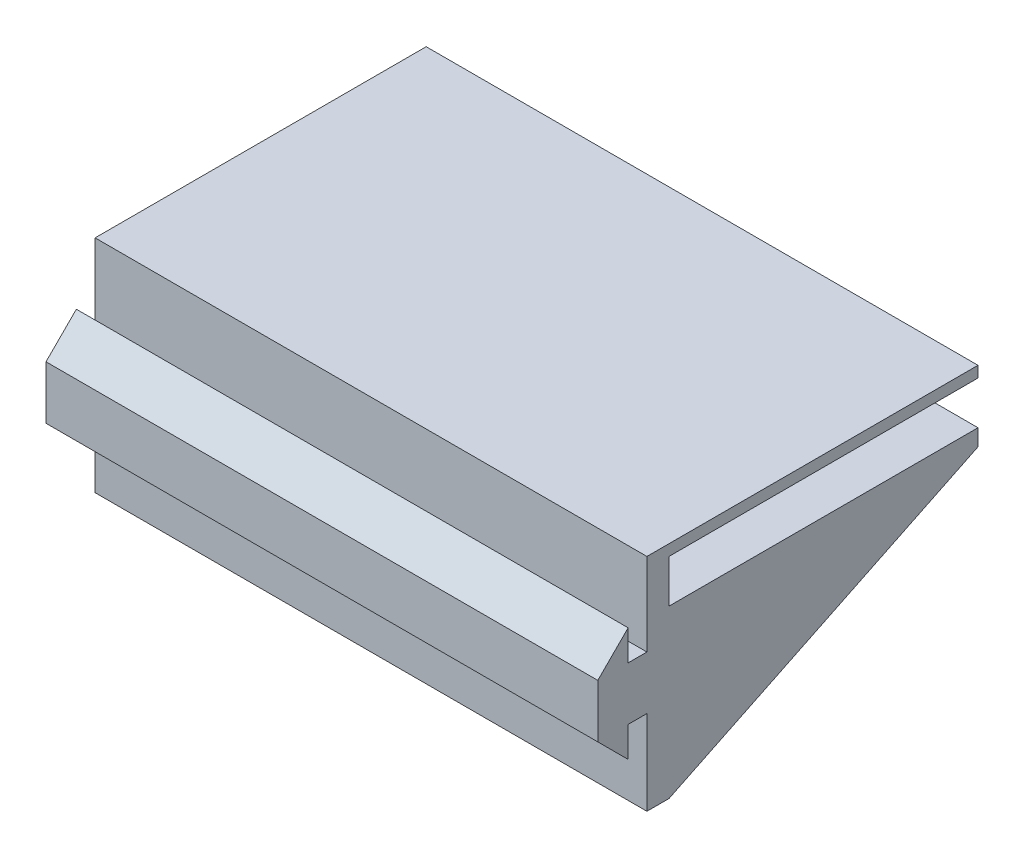
ISO-10303-21;
HEADER;
FILE_DESCRIPTION(('STEP AP214'),'2;1');
FILE_NAME('part.step','',(''),(''),'','','');
FILE_SCHEMA(('AUTOMOTIVE_DESIGN { 1 0 10303 214 1 1 1 1 }'));
ENDSEC;
DATA;
#1=APPLICATION_CONTEXT('core data for automotive mechanical design processes');
#2=APPLICATION_PROTOCOL_DEFINITION('international standard','automotive_design',2000,#1);
#3=PRODUCT_CONTEXT('',#1,'mechanical');
#4=PRODUCT('Part','Part','',(#3));
#5=PRODUCT_RELATED_PRODUCT_CATEGORY('part','',(#4));
#6=PRODUCT_DEFINITION_FORMATION('','',#4);
#7=PRODUCT_DEFINITION_CONTEXT('part definition',#1,'design');
#8=PRODUCT_DEFINITION('design','',#6,#7);
#9=PRODUCT_DEFINITION_SHAPE('','',#8);
#10=(LENGTH_UNIT() NAMED_UNIT(*) SI_UNIT(.MILLI.,.METRE.));
#11=(NAMED_UNIT(*) PLANE_ANGLE_UNIT() SI_UNIT($,.RADIAN.));
#12=(NAMED_UNIT(*) SI_UNIT($,.STERADIAN.) SOLID_ANGLE_UNIT());
#13=UNCERTAINTY_MEASURE_WITH_UNIT(LENGTH_MEASURE(1.E-05),#10,'distance_accuracy_value','');
#14=(GEOMETRIC_REPRESENTATION_CONTEXT(3) GLOBAL_UNCERTAINTY_ASSIGNED_CONTEXT((#13)) GLOBAL_UNIT_ASSIGNED_CONTEXT((#10,
#11,#12)) REPRESENTATION_CONTEXT('',''));
#15=CARTESIAN_POINT('',(0.,0.,0.));
#16=DIRECTION('',(0.,0.,1.));
#17=DIRECTION('',(1.,0.,0.));
#18=AXIS2_PLACEMENT_3D('',#15,#16,#17);
#19=CARTESIAN_POINT('',(50.,13.6,0.));
#20=DIRECTION('',(0.,-1.,0.));
#21=DIRECTION('',(0.,0.,-1.));
#22=AXIS2_PLACEMENT_3D('',#19,#20,#21);
#23=PLANE('',#22);
#24=DIRECTION('',(-1.,0.,0.));
#25=VECTOR('',#24,1.);
#26=CARTESIAN_POINT('',(50.,13.6,-30.));
#27=LINE('',#26,#25);
#28=CARTESIAN_POINT('',(48.5,13.6,-30.));
#29=VERTEX_POINT('',#28);
#30=CARTESIAN_POINT('',(1.5,13.6,-30.));
#31=VERTEX_POINT('',#30);
#32=EDGE_CURVE('E42',#29,#31,#27,.T.);
#33=ORIENTED_EDGE('',*,*,#32,.F.);
#34=DIRECTION('',(0.,0.,1.));
#35=VECTOR('',#34,1.);
#36=CARTESIAN_POINT('',(48.5,13.6,-30.));
#37=LINE('',#36,#35);
#38=CARTESIAN_POINT('',(48.5,13.6,-2.));
#39=VERTEX_POINT('',#38);
#40=EDGE_CURVE('E174',#29,#39,#37,.T.);
#41=ORIENTED_EDGE('',*,*,#40,.T.);
#42=DIRECTION('',(-1.,0.,0.));
#43=VECTOR('',#42,1.);
#44=CARTESIAN_POINT('',(50.,13.6,-2.));
#45=LINE('',#44,#43);
#46=CARTESIAN_POINT('',(1.5,13.6,-2.));
#47=VERTEX_POINT('',#46);
#48=EDGE_CURVE('E180',#39,#47,#45,.T.);
#49=ORIENTED_EDGE('',*,*,#48,.T.);
#50=DIRECTION('',(0.,0.,1.));
#51=VECTOR('',#50,1.);
#52=CARTESIAN_POINT('',(1.5,13.6,0.));
#53=LINE('',#52,#51);
#54=EDGE_CURVE('E349',#31,#47,#53,.T.);
#55=ORIENTED_EDGE('',*,*,#54,.F.);
#56=EDGE_LOOP('',(#33,#41,#49,#55));
#57=FACE_BOUND('',#56,.T.);
#58=ADVANCED_FACE('F35',(#57),#23,.T.);
#59=CARTESIAN_POINT('',(50.,0.,-2.));
#60=DIRECTION('',(0.,0.,1.));
#61=DIRECTION('',(0.,-1.,0.));
#62=AXIS2_PLACEMENT_3D('',#59,#60,#61);
#63=PLANE('',#62);
#64=DIRECTION('',(0.,-1.,0.));
#65=VECTOR('',#64,1.);
#66=CARTESIAN_POINT('',(48.5,13.6,-2.));
#67=LINE('',#66,#65);
#68=CARTESIAN_POINT('',(48.5,0.,-2.));
#69=VERTEX_POINT('',#68);
#70=EDGE_CURVE('E171',#39,#69,#67,.T.);
#71=ORIENTED_EDGE('',*,*,#70,.T.);
#72=DIRECTION('',(-1.,0.,0.));
#73=VECTOR('',#72,1.);
#74=CARTESIAN_POINT('',(50.,0.,-2.));
#75=LINE('',#74,#73);
#76=CARTESIAN_POINT('',(1.5,0.,-2.));
#77=VERTEX_POINT('',#76);
#78=EDGE_CURVE('E55',#69,#77,#75,.T.);
#79=ORIENTED_EDGE('',*,*,#78,.T.);
#80=DIRECTION('',(0.,1.,0.));
#81=VECTOR('',#80,1.);
#82=CARTESIAN_POINT('',(1.5,0.,-2.));
#83=LINE('',#82,#81);
#84=EDGE_CURVE('E185',#77,#47,#83,.T.);
#85=ORIENTED_EDGE('',*,*,#84,.T.);
#86=ORIENTED_EDGE('',*,*,#48,.F.);
#87=EDGE_LOOP('',(#71,#79,#85,#86));
#88=FACE_BOUND('',#87,.T.);
#89=ADVANCED_FACE('F183',(#88),#63,.F.);
#90=CARTESIAN_POINT('',(50.,0.,-30.));
#91=DIRECTION('',(0.,0.,-1.));
#92=DIRECTION('',(-1.,0.,0.));
#93=AXIS2_PLACEMENT_3D('',#90,#91,#92);
#94=PLANE('',#93);
#95=DIRECTION('',(0.,-1.,0.));
#96=VECTOR('',#95,1.);
#97=CARTESIAN_POINT('',(0.,0.,-30.));
#98=LINE('',#97,#96);
#99=CARTESIAN_POINT('',(0.,15.1,-30.));
#100=VERTEX_POINT('',#99);
#101=CARTESIAN_POINT('',(0.,13.6,-30.));
#102=VERTEX_POINT('',#101);
#103=EDGE_CURVE('E241',#100,#102,#98,.T.);
#104=ORIENTED_EDGE('',*,*,#103,.F.);
#105=DIRECTION('',(-1.,0.,0.));
#106=VECTOR('',#105,1.);
#107=CARTESIAN_POINT('',(50.,15.1,-30.));
#108=LINE('',#107,#106);
#109=CARTESIAN_POINT('',(50.,15.1,-30.));
#110=VERTEX_POINT('',#109);
#111=EDGE_CURVE('E227',#110,#100,#108,.T.);
#112=ORIENTED_EDGE('',*,*,#111,.F.);
#113=DIRECTION('',(0.,-1.,0.));
#114=VECTOR('',#113,1.);
#115=CARTESIAN_POINT('',(50.,0.,-30.));
#116=LINE('',#115,#114);
#117=CARTESIAN_POINT('',(50.,13.6,-30.));
#118=VERTEX_POINT('',#117);
#119=EDGE_CURVE('E291',#110,#118,#116,.T.);
#120=ORIENTED_EDGE('',*,*,#119,.T.);
#121=EDGE_CURVE('E11',#118,#29,#27,.T.);
#122=ORIENTED_EDGE('',*,*,#121,.T.);
#123=ORIENTED_EDGE('',*,*,#32,.T.);
#124=DIRECTION('',(-1.,0.,0.));
#125=VECTOR('',#124,1.);
#126=CARTESIAN_POINT('',(1.5,13.6,-30.));
#127=LINE('',#126,#125);
#128=EDGE_CURVE('E244',#31,#102,#127,.T.);
#129=ORIENTED_EDGE('',*,*,#128,.T.);
#130=EDGE_LOOP('',(#104,#112,#120,#122,#123,#129));
#131=FACE_BOUND('',#130,.T.);
#132=ADVANCED_FACE('F242',(#131),#94,.T.);
#133=CARTESIAN_POINT('',(50.,15.1,0.));
#134=DIRECTION('',(0.,1.,0.));
#135=DIRECTION('',(0.,0.,1.));
#136=AXIS2_PLACEMENT_3D('',#133,#134,#135);
#137=PLANE('',#136);
#138=DIRECTION('',(0.,0.,-1.));
#139=VECTOR('',#138,1.);
#140=CARTESIAN_POINT('',(0.,15.1,0.));
#141=LINE('',#140,#139);
#142=CARTESIAN_POINT('',(0.,15.1,-2.));
#143=VERTEX_POINT('',#142);
#144=EDGE_CURVE('E234',#143,#100,#141,.T.);
#145=ORIENTED_EDGE('',*,*,#144,.F.);
#146=DIRECTION('',(-1.,0.,0.));
#147=VECTOR('',#146,1.);
#148=CARTESIAN_POINT('',(50.,15.1,-2.));
#149=LINE('',#148,#147);
#150=CARTESIAN_POINT('',(50.,15.1,-2.));
#151=VERTEX_POINT('',#150);
#152=EDGE_CURVE('E226',#151,#143,#149,.T.);
#153=ORIENTED_EDGE('',*,*,#152,.F.);
#154=DIRECTION('',(0.,0.,-1.));
#155=VECTOR('',#154,1.);
#156=CARTESIAN_POINT('',(50.,15.1,0.));
#157=LINE('',#156,#155);
#158=EDGE_CURVE('E237',#151,#110,#157,.T.);
#159=ORIENTED_EDGE('',*,*,#158,.T.);
#160=ORIENTED_EDGE('',*,*,#111,.T.);
#161=EDGE_LOOP('',(#145,#153,#159,#160));
#162=FACE_BOUND('',#161,.T.);
#163=ADVANCED_FACE('F232',(#162),#137,.T.);
#164=CARTESIAN_POINT('',(50.,0.,-2.));
#165=DIRECTION('',(0.,0.,-1.));
#166=DIRECTION('',(0.,1.,0.));
#167=AXIS2_PLACEMENT_3D('',#164,#165,#166);
#168=PLANE('',#167);
#169=DIRECTION('',(0.,-1.,0.));
#170=VECTOR('',#169,1.);
#171=CARTESIAN_POINT('',(0.,0.,-2.));
#172=LINE('',#171,#170);
#173=CARTESIAN_POINT('',(0.,19.,-2.));
#174=VERTEX_POINT('',#173);
#175=EDGE_CURVE('E252',#174,#143,#172,.T.);
#176=ORIENTED_EDGE('',*,*,#175,.F.);
#177=DIRECTION('',(-1.,0.,0.));
#178=VECTOR('',#177,1.);
#179=CARTESIAN_POINT('',(50.,19.,-2.));
#180=LINE('',#179,#178);
#181=CARTESIAN_POINT('',(50.,19.,-2.));
#182=VERTEX_POINT('',#181);
#183=EDGE_CURVE('E224',#182,#174,#180,.T.);
#184=ORIENTED_EDGE('',*,*,#183,.F.);
#185=DIRECTION('',(0.,-1.,0.));
#186=VECTOR('',#185,1.);
#187=CARTESIAN_POINT('',(50.,0.,-2.));
#188=LINE('',#187,#186);
#189=EDGE_CURVE('E293',#182,#151,#188,.T.);
#190=ORIENTED_EDGE('',*,*,#189,.T.);
#191=ORIENTED_EDGE('',*,*,#152,.T.);
#192=EDGE_LOOP('',(#176,#184,#190,#191));
#193=FACE_BOUND('',#192,.T.);
#194=ADVANCED_FACE('F422',(#193),#168,.T.);
#195=CARTESIAN_POINT('',(50.,19.,0.));
#196=DIRECTION('',(0.,-1.,0.));
#197=DIRECTION('',(0.,0.,-1.));
#198=AXIS2_PLACEMENT_3D('',#195,#196,#197);
#199=PLANE('',#198);
#200=DIRECTION('',(0.,0.,1.));
#201=VECTOR('',#200,1.);
#202=CARTESIAN_POINT('',(0.,19.,0.));
#203=LINE('',#202,#201);
#204=CARTESIAN_POINT('',(0.,19.,-30.));
#205=VERTEX_POINT('',#204);
#206=EDGE_CURVE('E254',#205,#174,#203,.T.);
#207=ORIENTED_EDGE('',*,*,#206,.F.);
#208=DIRECTION('',(-1.,0.,0.));
#209=VECTOR('',#208,1.);
#210=CARTESIAN_POINT('',(50.,19.,-30.));
#211=LINE('',#210,#209);
#212=CARTESIAN_POINT('',(50.,19.,-30.));
#213=VERTEX_POINT('',#212);
#214=EDGE_CURVE('E222',#213,#205,#211,.T.);
#215=ORIENTED_EDGE('',*,*,#214,.F.);
#216=DIRECTION('',(0.,0.,1.));
#217=VECTOR('',#216,1.);
#218=CARTESIAN_POINT('',(50.,19.,0.));
#219=LINE('',#218,#217);
#220=EDGE_CURVE('E300',#213,#182,#219,.T.);
#221=ORIENTED_EDGE('',*,*,#220,.T.);
#222=ORIENTED_EDGE('',*,*,#183,.T.);
#223=EDGE_LOOP('',(#207,#215,#221,#222));
#224=FACE_BOUND('',#223,.T.);
#225=ADVANCED_FACE('F418',(#224),#199,.T.);
#226=CARTESIAN_POINT('',(50.,0.,-30.));
#227=DIRECTION('',(0.,0.,-1.));
#228=DIRECTION('',(-1.,0.,0.));
#229=AXIS2_PLACEMENT_3D('',#226,#227,#228);
#230=PLANE('',#229);
#231=DIRECTION('',(0.,-1.,0.));
#232=VECTOR('',#231,1.);
#233=CARTESIAN_POINT('',(0.,0.,-30.));
#234=LINE('',#233,#232);
#235=CARTESIAN_POINT('',(0.,20.,-30.));
#236=VERTEX_POINT('',#235);
#237=EDGE_CURVE('E258',#236,#205,#234,.T.);
#238=ORIENTED_EDGE('',*,*,#237,.F.);
#239=DIRECTION('',(-1.,0.,0.));
#240=VECTOR('',#239,1.);
#241=CARTESIAN_POINT('',(50.,20.,-30.));
#242=LINE('',#241,#240);
#243=CARTESIAN_POINT('',(50.,20.,-30.));
#244=VERTEX_POINT('',#243);
#245=EDGE_CURVE('E220',#244,#236,#242,.T.);
#246=ORIENTED_EDGE('',*,*,#245,.F.);
#247=DIRECTION('',(0.,-1.,0.));
#248=VECTOR('',#247,1.);
#249=CARTESIAN_POINT('',(50.,0.,-30.));
#250=LINE('',#249,#248);
#251=EDGE_CURVE('E303',#244,#213,#250,.T.);
#252=ORIENTED_EDGE('',*,*,#251,.T.);
#253=ORIENTED_EDGE('',*,*,#214,.T.);
#254=EDGE_LOOP('',(#238,#246,#252,#253));
#255=FACE_BOUND('',#254,.T.);
#256=ADVANCED_FACE('F414',(#255),#230,.T.);
#257=CARTESIAN_POINT('',(50.,20.,0.));
#258=DIRECTION('',(0.,1.,0.));
#259=DIRECTION('',(0.,0.,1.));
#260=AXIS2_PLACEMENT_3D('',#257,#258,#259);
#261=PLANE('',#260);
#262=DIRECTION('',(0.,0.,-1.));
#263=VECTOR('',#262,1.);
#264=CARTESIAN_POINT('',(0.,20.,0.));
#265=LINE('',#264,#263);
#266=CARTESIAN_POINT('',(0.,20.,0.));
#267=VERTEX_POINT('',#266);
#268=EDGE_CURVE('E261',#267,#236,#265,.T.);
#269=ORIENTED_EDGE('',*,*,#268,.F.);
#270=DIRECTION('',(-1.,0.,0.));
#271=VECTOR('',#270,1.);
#272=CARTESIAN_POINT('',(50.,20.,0.));
#273=LINE('',#272,#271);
#274=CARTESIAN_POINT('',(50.,20.,0.));
#275=VERTEX_POINT('',#274);
#276=EDGE_CURVE('E218',#275,#267,#273,.T.);
#277=ORIENTED_EDGE('',*,*,#276,.F.);
#278=DIRECTION('',(0.,0.,-1.));
#279=VECTOR('',#278,1.);
#280=CARTESIAN_POINT('',(50.,20.,0.));
#281=LINE('',#280,#279);
#282=EDGE_CURVE('E306',#275,#244,#281,.T.);
#283=ORIENTED_EDGE('',*,*,#282,.T.);
#284=ORIENTED_EDGE('',*,*,#245,.T.);
#285=EDGE_LOOP('',(#269,#277,#283,#284));
#286=FACE_BOUND('',#285,.T.);
#287=ADVANCED_FACE('F411',(#286),#261,.T.);
#288=CARTESIAN_POINT('',(50.,0.,0.));
#289=DIRECTION('',(0.,0.,1.));
#290=DIRECTION('',(1.,0.,0.));
#291=AXIS2_PLACEMENT_3D('',#288,#289,#290);
#292=PLANE('',#291);
#293=DIRECTION('',(0.,1.,0.));
#294=VECTOR('',#293,1.);
#295=CARTESIAN_POINT('',(0.,0.,0.));
#296=LINE('',#295,#294);
#297=CARTESIAN_POINT('',(0.,12.5,0.));
#298=VERTEX_POINT('',#297);
#299=EDGE_CURVE('E264',#298,#267,#296,.T.);
#300=ORIENTED_EDGE('',*,*,#299,.F.);
#301=DIRECTION('',(-1.,0.,0.));
#302=VECTOR('',#301,1.);
#303=CARTESIAN_POINT('',(50.,12.5,0.));
#304=LINE('',#303,#302);
#305=CARTESIAN_POINT('',(50.,12.5,0.));
#306=VERTEX_POINT('',#305);
#307=EDGE_CURVE('E216',#306,#298,#304,.T.);
#308=ORIENTED_EDGE('',*,*,#307,.F.);
#309=DIRECTION('',(0.,1.,0.));
#310=VECTOR('',#309,1.);
#311=CARTESIAN_POINT('',(50.,0.,0.));
#312=LINE('',#311,#310);
#313=EDGE_CURVE('E309',#306,#275,#312,.T.);
#314=ORIENTED_EDGE('',*,*,#313,.T.);
#315=ORIENTED_EDGE('',*,*,#276,.T.);
#316=EDGE_LOOP('',(#300,#308,#314,#315));
#317=FACE_BOUND('',#316,.T.);
#318=ADVANCED_FACE('F384',(#317),#292,.T.);
#319=CARTESIAN_POINT('',(50.,12.5,0.));
#320=DIRECTION('',(0.,1.,0.));
#321=DIRECTION('',(0.,0.,1.));
#322=AXIS2_PLACEMENT_3D('',#319,#320,#321);
#323=PLANE('',#322);
#324=DIRECTION('',(0.,0.,-1.));
#325=VECTOR('',#324,1.);
#326=CARTESIAN_POINT('',(0.,12.5,0.));
#327=LINE('',#326,#325);
#328=CARTESIAN_POINT('',(0.,12.5,1.7));
#329=VERTEX_POINT('',#328);
#330=EDGE_CURVE('E267',#329,#298,#327,.T.);
#331=ORIENTED_EDGE('',*,*,#330,.F.);
#332=DIRECTION('',(-1.,0.,0.));
#333=VECTOR('',#332,1.);
#334=CARTESIAN_POINT('',(50.,12.5,1.7));
#335=LINE('',#334,#333);
#336=CARTESIAN_POINT('',(50.,12.5,1.7));
#337=VERTEX_POINT('',#336);
#338=EDGE_CURVE('E214',#337,#329,#335,.T.);
#339=ORIENTED_EDGE('',*,*,#338,.F.);
#340=DIRECTION('',(0.,0.,-1.));
#341=VECTOR('',#340,1.);
#342=CARTESIAN_POINT('',(50.,12.5,0.));
#343=LINE('',#342,#341);
#344=EDGE_CURVE('E312',#337,#306,#343,.T.);
#345=ORIENTED_EDGE('',*,*,#344,.T.);
#346=ORIENTED_EDGE('',*,*,#307,.T.);
#347=EDGE_LOOP('',(#331,#339,#345,#346));
#348=FACE_BOUND('',#347,.T.);
#349=ADVANCED_FACE('F406',(#348),#323,.T.);
#350=CARTESIAN_POINT('',(50.,0.,1.7));
#351=DIRECTION('',(0.,0.,1.));
#352=DIRECTION('',(1.,0.,0.));
#353=AXIS2_PLACEMENT_3D('',#350,#351,#352);
#354=PLANE('',#353);
#355=DIRECTION('',(0.,1.,0.));
#356=VECTOR('',#355,1.);
#357=CARTESIAN_POINT('',(0.,0.,1.7));
#358=LINE('',#357,#356);
#359=CARTESIAN_POINT('',(0.,15.25,1.7));
#360=VERTEX_POINT('',#359);
#361=EDGE_CURVE('E271',#329,#360,#358,.T.);
#362=ORIENTED_EDGE('',*,*,#361,.T.);
#363=DIRECTION('',(-1.,0.,0.));
#364=VECTOR('',#363,1.);
#365=CARTESIAN_POINT('',(50.,15.25,1.7));
#366=LINE('',#365,#364);
#367=CARTESIAN_POINT('',(50.,15.25,1.7));
#368=VERTEX_POINT('',#367);
#369=EDGE_CURVE('E211',#368,#360,#366,.T.);
#370=ORIENTED_EDGE('',*,*,#369,.F.);
#371=DIRECTION('',(0.,1.,0.));
#372=VECTOR('',#371,1.);
#373=CARTESIAN_POINT('',(50.,0.,1.7));
#374=LINE('',#373,#372);
#375=EDGE_CURVE('E315',#337,#368,#374,.T.);
#376=ORIENTED_EDGE('',*,*,#375,.F.);
#377=ORIENTED_EDGE('',*,*,#338,.T.);
#378=EDGE_LOOP('',(#362,#370,#376,#377));
#379=FACE_BOUND('',#378,.T.);
#380=ADVANCED_FACE('F402',(#379),#354,.F.);
#381=CARTESIAN_POINT('',(50.,8.47499999999992,8.47500000000001));
#382=DIRECTION('',(0.,-0.707106781186544,-0.707106781186551));
#383=DIRECTION('',(0.,0.707106781186551,-0.707106781186544));
#384=AXIS2_PLACEMENT_3D('',#381,#382,#383);
#385=PLANE('',#384);
#386=DIRECTION('',(0.,-0.707106781186551,0.707106781186544));
#387=VECTOR('',#386,1.);
#388=CARTESIAN_POINT('',(0.,8.47499999999992,8.47500000000001));
#389=LINE('',#388,#387);
#390=CARTESIAN_POINT('',(0.,12.5,4.44999999999997));
#391=VERTEX_POINT('',#390);
#392=EDGE_CURVE('E273',#360,#391,#389,.T.);
#393=ORIENTED_EDGE('',*,*,#392,.T.);
#394=DIRECTION('',(-1.,0.,0.));
#395=VECTOR('',#394,1.);
#396=CARTESIAN_POINT('',(50.,12.5,4.44999999999997));
#397=LINE('',#396,#395);
#398=CARTESIAN_POINT('',(50.,12.5,4.44999999999997));
#399=VERTEX_POINT('',#398);
#400=EDGE_CURVE('E208',#399,#391,#397,.T.);
#401=ORIENTED_EDGE('',*,*,#400,.F.);
#402=DIRECTION('',(0.,-0.707106781186551,0.707106781186544));
#403=VECTOR('',#402,1.);
#404=CARTESIAN_POINT('',(50.,8.47499999999992,8.47500000000001));
#405=LINE('',#404,#403);
#406=EDGE_CURVE('E317',#368,#399,#405,.T.);
#407=ORIENTED_EDGE('',*,*,#406,.F.);
#408=ORIENTED_EDGE('',*,*,#369,.T.);
#409=EDGE_LOOP('',(#393,#401,#407,#408));
#410=FACE_BOUND('',#409,.T.);
#411=ADVANCED_FACE('F398',(#410),#385,.F.);
#412=CARTESIAN_POINT('',(50.,0.,4.44999999999997));
#413=DIRECTION('',(0.,0.,-1.));
#414=DIRECTION('',(-1.,0.,0.));
#415=AXIS2_PLACEMENT_3D('',#412,#413,#414);
#416=PLANE('',#415);
#417=DIRECTION('',(0.,-1.,0.));
#418=VECTOR('',#417,1.);
#419=CARTESIAN_POINT('',(0.,0.,4.44999999999997));
#420=LINE('',#419,#418);
#421=CARTESIAN_POINT('',(0.,7.67168062195139,4.44999999999997));
#422=VERTEX_POINT('',#421);
#423=EDGE_CURVE('E275',#391,#422,#420,.T.);
#424=ORIENTED_EDGE('',*,*,#423,.T.);
#425=DIRECTION('',(-1.,0.,0.));
#426=VECTOR('',#425,1.);
#427=CARTESIAN_POINT('',(50.,7.67168062195139,4.44999999999997));
#428=LINE('',#427,#426);
#429=CARTESIAN_POINT('',(50.,7.67168062195139,4.44999999999997));
#430=VERTEX_POINT('',#429);
#431=EDGE_CURVE('E206',#430,#422,#428,.T.);
#432=ORIENTED_EDGE('',*,*,#431,.F.);
#433=DIRECTION('',(0.,-1.,0.));
#434=VECTOR('',#433,1.);
#435=CARTESIAN_POINT('',(50.,0.,4.44999999999997));
#436=LINE('',#435,#434);
#437=EDGE_CURVE('E319',#399,#430,#436,.T.);
#438=ORIENTED_EDGE('',*,*,#437,.F.);
#439=ORIENTED_EDGE('',*,*,#400,.T.);
#440=EDGE_LOOP('',(#424,#432,#438,#439));
#441=FACE_BOUND('',#440,.T.);
#442=ADVANCED_FACE('F394',(#441),#416,.F.);
#443=CARTESIAN_POINT('',(50.,1.61084031097575,-1.61084031097573));
#444=DIRECTION('',(0.,-0.707106781186551,0.707106781186544));
#445=DIRECTION('',(0.,-0.707106781186544,-0.707106781186551));
#446=AXIS2_PLACEMENT_3D('',#443,#444,#445);
#447=PLANE('',#446);
#448=DIRECTION('',(0.,0.707106781186544,0.707106781186551));
#449=VECTOR('',#448,1.);
#450=CARTESIAN_POINT('',(0.,1.61084031097575,-1.61084031097573));
#451=LINE('',#450,#449);
#452=CARTESIAN_POINT('',(0.,4.92168062195145,1.7));
#453=VERTEX_POINT('',#452);
#454=EDGE_CURVE('E278',#453,#422,#451,.T.);
#455=ORIENTED_EDGE('',*,*,#454,.F.);
#456=DIRECTION('',(-1.,0.,0.));
#457=VECTOR('',#456,1.);
#458=CARTESIAN_POINT('',(50.,4.92168062195145,1.7));
#459=LINE('',#458,#457);
#460=CARTESIAN_POINT('',(50.,4.92168062195145,1.7));
#461=VERTEX_POINT('',#460);
#462=EDGE_CURVE('E204',#461,#453,#459,.T.);
#463=ORIENTED_EDGE('',*,*,#462,.F.);
#464=DIRECTION('',(0.,0.707106781186544,0.707106781186551));
#465=VECTOR('',#464,1.);
#466=CARTESIAN_POINT('',(50.,1.61084031097575,-1.61084031097573));
#467=LINE('',#466,#465);
#468=EDGE_CURVE('E321',#461,#430,#467,.T.);
#469=ORIENTED_EDGE('',*,*,#468,.T.);
#470=ORIENTED_EDGE('',*,*,#431,.T.);
#471=EDGE_LOOP('',(#455,#463,#469,#470));
#472=FACE_BOUND('',#471,.T.);
#473=ADVANCED_FACE('F390',(#472),#447,.T.);
#474=CARTESIAN_POINT('',(50.,0.,1.7));
#475=DIRECTION('',(0.,0.,-1.));
#476=DIRECTION('',(0.,1.,0.));
#477=AXIS2_PLACEMENT_3D('',#474,#475,#476);
#478=PLANE('',#477);
#479=DIRECTION('',(0.,-1.,0.));
#480=VECTOR('',#479,1.);
#481=CARTESIAN_POINT('',(0.,0.,1.7));
#482=LINE('',#481,#480);
#483=CARTESIAN_POINT('',(0.,7.67168062195145,1.7));
#484=VERTEX_POINT('',#483);
#485=EDGE_CURVE('E281',#484,#453,#482,.T.);
#486=ORIENTED_EDGE('',*,*,#485,.F.);
#487=DIRECTION('',(-1.,0.,0.));
#488=VECTOR('',#487,1.);
#489=CARTESIAN_POINT('',(50.,7.67168062195145,1.7));
#490=LINE('',#489,#488);
#491=CARTESIAN_POINT('',(50.,7.67168062195145,1.7));
#492=VERTEX_POINT('',#491);
#493=EDGE_CURVE('E202',#492,#484,#490,.T.);
#494=ORIENTED_EDGE('',*,*,#493,.F.);
#495=DIRECTION('',(0.,-1.,0.));
#496=VECTOR('',#495,1.);
#497=CARTESIAN_POINT('',(50.,0.,1.7));
#498=LINE('',#497,#496);
#499=EDGE_CURVE('E324',#492,#461,#498,.T.);
#500=ORIENTED_EDGE('',*,*,#499,.T.);
#501=ORIENTED_EDGE('',*,*,#462,.T.);
#502=EDGE_LOOP('',(#486,#494,#500,#501));
#503=FACE_BOUND('',#502,.T.);
#504=ADVANCED_FACE('F387',(#503),#478,.T.);
#505=CARTESIAN_POINT('',(50.,7.67168062195145,0.));
#506=DIRECTION('',(0.,1.,0.));
#507=DIRECTION('',(0.,0.,1.));
#508=AXIS2_PLACEMENT_3D('',#505,#506,#507);
#509=PLANE('',#508);
#510=DIRECTION('',(0.,0.,-1.));
#511=VECTOR('',#510,1.);
#512=CARTESIAN_POINT('',(0.,7.67168062195145,0.));
#513=LINE('',#512,#511);
#514=CARTESIAN_POINT('',(0.,7.67168062195145,0.));
#515=VERTEX_POINT('',#514);
#516=EDGE_CURVE('E283',#484,#515,#513,.T.);
#517=ORIENTED_EDGE('',*,*,#516,.T.);
#518=DIRECTION('',(-1.,0.,0.));
#519=VECTOR('',#518,1.);
#520=CARTESIAN_POINT('',(50.,7.67168062195145,0.));
#521=LINE('',#520,#519);
#522=CARTESIAN_POINT('',(50.,7.67168062195145,0.));
#523=VERTEX_POINT('',#522);
#524=EDGE_CURVE('E200',#523,#515,#521,.T.);
#525=ORIENTED_EDGE('',*,*,#524,.F.);
#526=DIRECTION('',(0.,0.,-1.));
#527=VECTOR('',#526,1.);
#528=CARTESIAN_POINT('',(50.,7.67168062195145,0.));
#529=LINE('',#528,#527);
#530=EDGE_CURVE('E327',#492,#523,#529,.T.);
#531=ORIENTED_EDGE('',*,*,#530,.F.);
#532=ORIENTED_EDGE('',*,*,#493,.T.);
#533=EDGE_LOOP('',(#517,#525,#531,#532));
#534=FACE_BOUND('',#533,.T.);
#535=ADVANCED_FACE('F383',(#534),#509,.F.);
#536=CARTESIAN_POINT('',(0.,0.,0.));
#537=VERTEX_POINT('',#536);
#538=EDGE_CURVE('E268',#537,#515,#296,.T.);
#539=ORIENTED_EDGE('',*,*,#538,.F.);
#540=DIRECTION('',(-1.,0.,0.));
#541=VECTOR('',#540,1.);
#542=CARTESIAN_POINT('',(50.,0.,0.));
#543=LINE('',#542,#541);
#544=CARTESIAN_POINT('',(50.,0.,0.));
#545=VERTEX_POINT('',#544);
#546=EDGE_CURVE('E198',#545,#537,#543,.T.);
#547=ORIENTED_EDGE('',*,*,#546,.F.);
#548=EDGE_CURVE('E192',#545,#523,#312,.T.);
#549=ORIENTED_EDGE('',*,*,#548,.T.);
#550=ORIENTED_EDGE('',*,*,#524,.T.);
#551=EDGE_LOOP('',(#539,#547,#549,#550));
#552=FACE_BOUND('',#551,.T.);
#553=ADVANCED_FACE('F334',(#552),#292,.T.);
#554=CARTESIAN_POINT('',(50.,0.,0.));
#555=DIRECTION('',(0.,-1.,0.));
#556=DIRECTION('',(0.,0.,-1.));
#557=AXIS2_PLACEMENT_3D('',#554,#555,#556);
#558=PLANE('',#557);
#559=DIRECTION('',(0.,0.,1.));
#560=VECTOR('',#559,1.);
#561=CARTESIAN_POINT('',(0.,0.,0.));
#562=LINE('',#561,#560);
#563=CARTESIAN_POINT('',(0.,0.,-2.));
#564=VERTEX_POINT('',#563);
#565=EDGE_CURVE('E195',#564,#537,#562,.T.);
#566=ORIENTED_EDGE('',*,*,#565,.F.);
#567=DIRECTION('',(-1.,0.,0.));
#568=VECTOR('',#567,1.);
#569=CARTESIAN_POINT('',(1.5,0.,-2.));
#570=LINE('',#569,#568);
#571=EDGE_CURVE('E353',#77,#564,#570,.T.);
#572=ORIENTED_EDGE('',*,*,#571,.F.);
#573=ORIENTED_EDGE('',*,*,#78,.F.);
#574=CARTESIAN_POINT('',(50.,0.,-2.));
#575=VERTEX_POINT('',#574);
#576=EDGE_CURVE('E189',#575,#69,#75,.T.);
#577=ORIENTED_EDGE('',*,*,#576,.F.);
#578=DIRECTION('',(0.,0.,1.));
#579=VECTOR('',#578,1.);
#580=CARTESIAN_POINT('',(50.,0.,0.));
#581=LINE('',#580,#579);
#582=EDGE_CURVE('E187',#575,#545,#581,.T.);
#583=ORIENTED_EDGE('',*,*,#582,.T.);
#584=ORIENTED_EDGE('',*,*,#546,.T.);
#585=EDGE_LOOP('',(#566,#572,#573,#577,#583,#584));
#586=FACE_BOUND('',#585,.T.);
#587=ADVANCED_FACE('F340',(#586),#558,.T.);
#588=CARTESIAN_POINT('',(50.,0.,0.));
#589=DIRECTION('',(1.,0.,0.));
#590=DIRECTION('',(0.,0.,-1.));
#591=AXIS2_PLACEMENT_3D('',#588,#589,#590);
#592=PLANE('',#591);
#593=DIRECTION('',(0.,0.436903962736913,-0.899508158575998));
#594=VECTOR('',#593,1.);
#595=CARTESIAN_POINT('',(50.,0.,-2.));
#596=LINE('',#595,#594);
#597=EDGE_CURVE('E181',#575,#118,#596,.T.);
#598=ORIENTED_EDGE('',*,*,#597,.T.);
#599=ORIENTED_EDGE('',*,*,#119,.F.);
#600=ORIENTED_EDGE('',*,*,#158,.F.);
#601=ORIENTED_EDGE('',*,*,#189,.F.);
#602=ORIENTED_EDGE('',*,*,#220,.F.);
#603=ORIENTED_EDGE('',*,*,#251,.F.);
#604=ORIENTED_EDGE('',*,*,#282,.F.);
#605=ORIENTED_EDGE('',*,*,#313,.F.);
#606=ORIENTED_EDGE('',*,*,#344,.F.);
#607=ORIENTED_EDGE('',*,*,#375,.T.);
#608=ORIENTED_EDGE('',*,*,#406,.T.);
#609=ORIENTED_EDGE('',*,*,#437,.T.);
#610=ORIENTED_EDGE('',*,*,#468,.F.);
#611=ORIENTED_EDGE('',*,*,#499,.F.);
#612=ORIENTED_EDGE('',*,*,#530,.T.);
#613=ORIENTED_EDGE('',*,*,#548,.F.);
#614=ORIENTED_EDGE('',*,*,#582,.F.);
#615=EDGE_LOOP('',(#598,#599,#600,#601,#602,#603,#604,#605,#606,#607,#608,#609,#610,#611,#612,
#613,#614));
#616=FACE_BOUND('',#615,.T.);
#617=ADVANCED_FACE('F337',(#616),#592,.T.);
#618=CARTESIAN_POINT('',(0.,0.,0.));
#619=DIRECTION('',(1.,0.,0.));
#620=DIRECTION('',(0.,0.,-1.));
#621=AXIS2_PLACEMENT_3D('',#618,#619,#620);
#622=PLANE('',#621);
#623=ORIENTED_EDGE('',*,*,#103,.T.);
#624=DIRECTION('',(0.,-0.436903962736913,0.899508158575998));
#625=VECTOR('',#624,1.);
#626=CARTESIAN_POINT('',(0.,-0.785997357992075,-0.381770145310436));
#627=LINE('',#626,#625);
#628=EDGE_CURVE('E350',#102,#564,#627,.T.);
#629=ORIENTED_EDGE('',*,*,#628,.T.);
#630=ORIENTED_EDGE('',*,*,#565,.T.);
#631=ORIENTED_EDGE('',*,*,#538,.T.);
#632=ORIENTED_EDGE('',*,*,#516,.F.);
#633=ORIENTED_EDGE('',*,*,#485,.T.);
#634=ORIENTED_EDGE('',*,*,#454,.T.);
#635=ORIENTED_EDGE('',*,*,#423,.F.);
#636=ORIENTED_EDGE('',*,*,#392,.F.);
#637=ORIENTED_EDGE('',*,*,#361,.F.);
#638=ORIENTED_EDGE('',*,*,#330,.T.);
#639=ORIENTED_EDGE('',*,*,#299,.T.);
#640=ORIENTED_EDGE('',*,*,#268,.T.);
#641=ORIENTED_EDGE('',*,*,#237,.T.);
#642=ORIENTED_EDGE('',*,*,#206,.T.);
#643=ORIENTED_EDGE('',*,*,#175,.T.);
#644=ORIENTED_EDGE('',*,*,#144,.T.);
#645=EDGE_LOOP('',(#623,#629,#630,#631,#632,#633,#634,#635,#636,#637,#638,#639,#640,#641,#642,
#643,#644));
#646=FACE_BOUND('',#645,.T.);
#647=ADVANCED_FACE('F249',(#646),#622,.F.);
#648=CARTESIAN_POINT('',(1.5,-0.785997357992075,-0.381770145310436));
#649=DIRECTION('',(0.,-0.899508158575998,-0.436903962736913));
#650=DIRECTION('',(0.,0.436903962736913,-0.899508158575998));
#651=AXIS2_PLACEMENT_3D('',#648,#649,#650);
#652=PLANE('',#651);
#653=ORIENTED_EDGE('',*,*,#628,.F.);
#654=ORIENTED_EDGE('',*,*,#128,.F.);
#655=DIRECTION('',(0.,-0.436903962736913,0.899508158575998));
#656=VECTOR('',#655,1.);
#657=CARTESIAN_POINT('',(1.5,-0.785997357992075,-0.381770145310436));
#658=LINE('',#657,#656);
#659=EDGE_CURVE('E346',#31,#77,#658,.T.);
#660=ORIENTED_EDGE('',*,*,#659,.T.);
#661=ORIENTED_EDGE('',*,*,#571,.T.);
#662=EDGE_LOOP('',(#653,#654,#660,#661));
#663=FACE_BOUND('',#662,.T.);
#664=ADVANCED_FACE('F356',(#663),#652,.T.);
#665=CARTESIAN_POINT('',(1.5,0.,0.));
#666=DIRECTION('',(1.,0.,0.));
#667=DIRECTION('',(0.,0.,-1.));
#668=AXIS2_PLACEMENT_3D('',#665,#666,#667);
#669=PLANE('',#668);
#670=ORIENTED_EDGE('',*,*,#659,.F.);
#671=ORIENTED_EDGE('',*,*,#54,.T.);
#672=ORIENTED_EDGE('',*,*,#84,.F.);
#673=EDGE_LOOP('',(#670,#671,#672));
#674=FACE_BOUND('',#673,.T.);
#675=ADVANCED_FACE('F359',(#674),#669,.T.);
#676=CARTESIAN_POINT('',(48.5,0.,-2.));
#677=DIRECTION('',(0.,-0.899508158575998,-0.436903962736913));
#678=DIRECTION('',(0.,0.436903962736913,-0.899508158575998));
#679=AXIS2_PLACEMENT_3D('',#676,#677,#678);
#680=PLANE('',#679);
#681=ORIENTED_EDGE('',*,*,#597,.F.);
#682=ORIENTED_EDGE('',*,*,#576,.T.);
#683=DIRECTION('',(0.,0.436903962736913,-0.899508158575998));
#684=VECTOR('',#683,1.);
#685=CARTESIAN_POINT('',(48.5,0.,-2.));
#686=LINE('',#685,#684);
#687=EDGE_CURVE('E176',#69,#29,#686,.T.);
#688=ORIENTED_EDGE('',*,*,#687,.T.);
#689=ORIENTED_EDGE('',*,*,#121,.F.);
#690=EDGE_LOOP('',(#681,#682,#688,#689));
#691=FACE_BOUND('',#690,.T.);
#692=ADVANCED_FACE('F342',(#691),#680,.T.);
#693=CARTESIAN_POINT('',(48.5,0.,0.));
#694=DIRECTION('',(1.,0.,0.));
#695=DIRECTION('',(0.,0.,-1.));
#696=AXIS2_PLACEMENT_3D('',#693,#694,#695);
#697=PLANE('',#696);
#698=ORIENTED_EDGE('',*,*,#40,.F.);
#699=ORIENTED_EDGE('',*,*,#687,.F.);
#700=ORIENTED_EDGE('',*,*,#70,.F.);
#701=EDGE_LOOP('',(#698,#699,#700));
#702=FACE_BOUND('',#701,.T.);
#703=ADVANCED_FACE('F173',(#702),#697,.F.);
#704=CLOSED_SHELL('',(#58,#89,#132,#163,#194,#225,#256,#287,#318,#349,#380,#411,#442,#473,#504,
#535,#553,#587,#617,#647,#664,#675,#692,#703));
#705=MANIFOLD_SOLID_BREP('B2',#704);
#706=ADVANCED_BREP_SHAPE_REPRESENTATION('',(#18,#705),#14);
#707=SHAPE_DEFINITION_REPRESENTATION(#9,#706);
ENDSEC;
END-ISO-10303-21;
